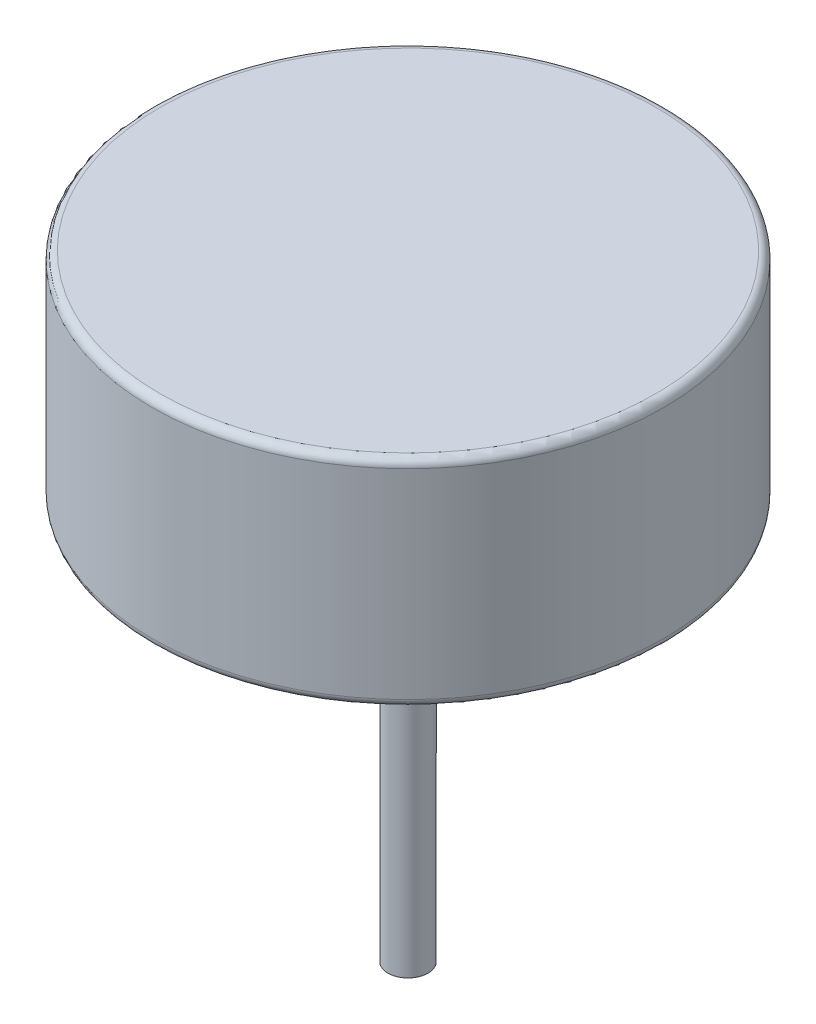
ISO-10303-21;
HEADER;
FILE_DESCRIPTION(('STEP AP214'),'2;1');
FILE_NAME('part.step','',(''),(''),'','','');
FILE_SCHEMA(('AUTOMOTIVE_DESIGN { 1 0 10303 214 1 1 1 1 }'));
ENDSEC;
DATA;
#1=APPLICATION_CONTEXT('core data for automotive mechanical design processes');
#2=APPLICATION_PROTOCOL_DEFINITION('international standard','automotive_design',2000,#1);
#3=PRODUCT_CONTEXT('',#1,'mechanical');
#4=PRODUCT('Part','Part','',(#3));
#5=PRODUCT_RELATED_PRODUCT_CATEGORY('part','',(#4));
#6=PRODUCT_DEFINITION_FORMATION('','',#4);
#7=PRODUCT_DEFINITION_CONTEXT('part definition',#1,'design');
#8=PRODUCT_DEFINITION('design','',#6,#7);
#9=PRODUCT_DEFINITION_SHAPE('','',#8);
#10=(LENGTH_UNIT() NAMED_UNIT(*) SI_UNIT(.MILLI.,.METRE.));
#11=(NAMED_UNIT(*) PLANE_ANGLE_UNIT() SI_UNIT($,.RADIAN.));
#12=(NAMED_UNIT(*) SI_UNIT($,.STERADIAN.) SOLID_ANGLE_UNIT());
#13=UNCERTAINTY_MEASURE_WITH_UNIT(LENGTH_MEASURE(1.E-05),#10,'distance_accuracy_value','');
#14=(GEOMETRIC_REPRESENTATION_CONTEXT(3) GLOBAL_UNCERTAINTY_ASSIGNED_CONTEXT((#13)) GLOBAL_UNIT_ASSIGNED_CONTEXT((#10,
#11,#12)) REPRESENTATION_CONTEXT('',''));
#15=CARTESIAN_POINT('',(0.,0.,0.));
#16=DIRECTION('',(0.,0.,1.));
#17=DIRECTION('',(1.,0.,0.));
#18=AXIS2_PLACEMENT_3D('',#15,#16,#17);
#19=CARTESIAN_POINT('',(0.,13.5,0.));
#20=DIRECTION('',(0.,-1.,0.));
#21=DIRECTION('',(0.,0.,-1.));
#22=AXIS2_PLACEMENT_3D('',#19,#20,#21);
#23=CYLINDRICAL_SURFACE('',#22,32.);
#24=CARTESIAN_POINT('',(0.,12.5,0.));
#25=DIRECTION('',(0.,1.,0.));
#26=DIRECTION('',(0.,0.,1.));
#27=AXIS2_PLACEMENT_3D('',#24,#25,#26);
#28=CIRCLE('',#27,32.);
#29=CARTESIAN_POINT('',(0.,12.5,32.));
#30=VERTEX_POINT('',#29);
#31=EDGE_CURVE('E42',#30,#30,#28,.F.);
#32=ORIENTED_EDGE('',*,*,#31,.T.);
#33=EDGE_LOOP('',(#32));
#34=FACE_BOUND('',#33,.T.);
#35=CARTESIAN_POINT('',(0.,-12.5,0.));
#36=DIRECTION('',(0.,1.,0.));
#37=DIRECTION('',(0.,0.,1.));
#38=AXIS2_PLACEMENT_3D('',#35,#36,#37);
#39=CIRCLE('',#38,32.);
#40=CARTESIAN_POINT('',(0.,-12.5,32.));
#41=VERTEX_POINT('',#40);
#42=EDGE_CURVE('E55',#41,#41,#39,.T.);
#43=ORIENTED_EDGE('',*,*,#42,.T.);
#44=EDGE_LOOP('',(#43));
#45=FACE_BOUND('',#44,.T.);
#46=ADVANCED_FACE('F35',(#34,#45),#23,.T.);
#47=CARTESIAN_POINT('',(0.,13.5,0.));
#48=DIRECTION('',(0.,1.,0.));
#49=DIRECTION('',(0.,0.,1.));
#50=AXIS2_PLACEMENT_3D('',#47,#48,#49);
#51=PLANE('',#50);
#52=CARTESIAN_POINT('',(0.,13.5,0.));
#53=DIRECTION('',(0.,1.,0.));
#54=DIRECTION('',(0.,0.,1.));
#55=AXIS2_PLACEMENT_3D('',#52,#53,#54);
#56=CIRCLE('',#55,31.);
#57=CARTESIAN_POINT('',(0.,13.5,31.));
#58=VERTEX_POINT('',#57);
#59=EDGE_CURVE('E46',#58,#58,#56,.T.);
#60=ORIENTED_EDGE('',*,*,#59,.T.);
#61=EDGE_LOOP('',(#60));
#62=FACE_BOUND('',#61,.T.);
#63=ADVANCED_FACE('F76',(#62),#51,.T.);
#64=CARTESIAN_POINT('',(0.,-13.5,0.));
#65=DIRECTION('',(0.,1.,0.));
#66=DIRECTION('',(0.,0.,1.));
#67=AXIS2_PLACEMENT_3D('',#64,#65,#66);
#68=PLANE('',#67);
#69=CARTESIAN_POINT('',(0.,-13.5,0.));
#70=DIRECTION('',(0.,1.,0.));
#71=DIRECTION('',(0.,0.,1.));
#72=AXIS2_PLACEMENT_3D('',#69,#70,#71);
#73=CIRCLE('',#72,2.5);
#74=CARTESIAN_POINT('',(0.,-13.5,2.5));
#75=VERTEX_POINT('',#74);
#76=EDGE_CURVE('E10',#75,#75,#73,.F.);
#77=ORIENTED_EDGE('',*,*,#76,.F.);
#78=EDGE_LOOP('',(#77));
#79=FACE_BOUND('',#78,.T.);
#80=CARTESIAN_POINT('',(0.,-13.5,0.));
#81=DIRECTION('',(0.,1.,0.));
#82=DIRECTION('',(0.,0.,1.));
#83=AXIS2_PLACEMENT_3D('',#80,#81,#82);
#84=CIRCLE('',#83,31.);
#85=CARTESIAN_POINT('',(0.,-13.5,31.));
#86=VERTEX_POINT('',#85);
#87=EDGE_CURVE('E50',#86,#86,#84,.F.);
#88=ORIENTED_EDGE('',*,*,#87,.T.);
#89=EDGE_LOOP('',(#88));
#90=FACE_BOUND('',#89,.T.);
#91=ADVANCED_FACE('F81',(#79,#90),#68,.F.);
#92=CARTESIAN_POINT('',(0.,-12.5,0.));
#93=DIRECTION('',(0.,1.,0.));
#94=DIRECTION('',(0.,0.,1.));
#95=AXIS2_PLACEMENT_3D('',#92,#93,#94);
#96=TOROIDAL_SURFACE('',#95,31.,1.);
#97=ORIENTED_EDGE('',*,*,#87,.F.);
#98=EDGE_LOOP('',(#97));
#99=FACE_BOUND('',#98,.T.);
#100=ORIENTED_EDGE('',*,*,#42,.F.);
#101=EDGE_LOOP('',(#100));
#102=FACE_BOUND('',#101,.T.);
#103=ADVANCED_FACE('F72',(#99,#102),#96,.T.);
#104=CARTESIAN_POINT('',(0.,12.5,0.));
#105=DIRECTION('',(0.,1.,0.));
#106=DIRECTION('',(0.,0.,1.));
#107=AXIS2_PLACEMENT_3D('',#104,#105,#106);
#108=TOROIDAL_SURFACE('',#107,31.,1.);
#109=ORIENTED_EDGE('',*,*,#31,.F.);
#110=EDGE_LOOP('',(#109));
#111=FACE_BOUND('',#110,.T.);
#112=ORIENTED_EDGE('',*,*,#59,.F.);
#113=EDGE_LOOP('',(#112));
#114=FACE_BOUND('',#113,.T.);
#115=ADVANCED_FACE('F37',(#111,#114),#108,.T.);
#116=CARTESIAN_POINT('',(0.,-63.5,0.));
#117=DIRECTION('',(0.,1.,0.));
#118=DIRECTION('',(0.,0.,1.));
#119=AXIS2_PLACEMENT_3D('',#116,#117,#118);
#120=CYLINDRICAL_SURFACE('',#119,2.5);
#121=CARTESIAN_POINT('',(0.,-63.5,0.));
#122=DIRECTION('',(0.,-1.,0.));
#123=DIRECTION('',(0.,0.,-1.));
#124=AXIS2_PLACEMENT_3D('',#121,#122,#123);
#125=CIRCLE('',#124,2.5);
#126=CARTESIAN_POINT('',(0.,-63.5,-2.5));
#127=VERTEX_POINT('',#126);
#128=EDGE_CURVE('E58',#127,#127,#125,.T.);
#129=ORIENTED_EDGE('',*,*,#128,.F.);
#130=EDGE_LOOP('',(#129));
#131=FACE_BOUND('',#130,.T.);
#132=ORIENTED_EDGE('',*,*,#76,.T.);
#133=EDGE_LOOP('',(#132));
#134=FACE_BOUND('',#133,.T.);
#135=ADVANCED_FACE('F64',(#131,#134),#120,.T.);
#136=CARTESIAN_POINT('',(0.,-63.5,0.));
#137=DIRECTION('',(0.,-1.,0.));
#138=DIRECTION('',(0.,0.,-1.));
#139=AXIS2_PLACEMENT_3D('',#136,#137,#138);
#140=PLANE('',#139);
#141=ORIENTED_EDGE('',*,*,#128,.T.);
#142=EDGE_LOOP('',(#141));
#143=FACE_BOUND('',#142,.T.);
#144=ADVANCED_FACE('F62',(#143),#140,.T.);
#145=CLOSED_SHELL('',(#46,#63,#91,#103,#115,#135,#144));
#146=MANIFOLD_SOLID_BREP('B2',#145);
#147=ADVANCED_BREP_SHAPE_REPRESENTATION('',(#18,#146),#14);
#148=SHAPE_DEFINITION_REPRESENTATION(#9,#147);
ENDSEC;
END-ISO-10303-21;
